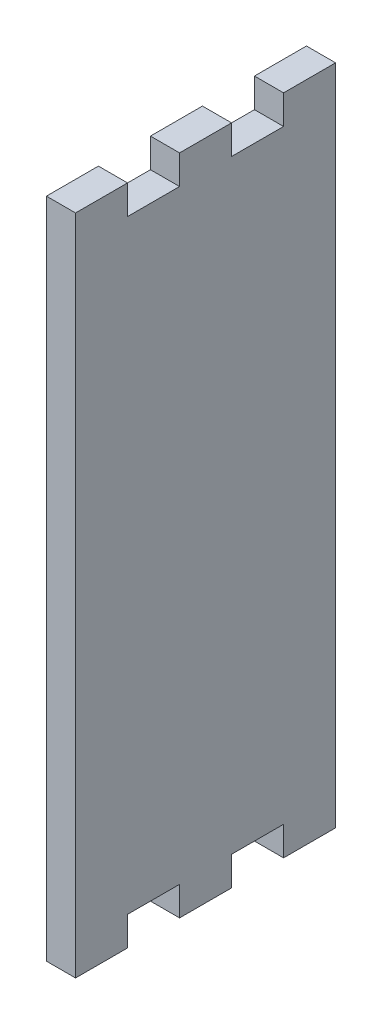
ISO-10303-21;
HEADER;
FILE_DESCRIPTION(('STEP AP214'),'2;1');
FILE_NAME('part.step','',(''),(''),'','','');
FILE_SCHEMA(('AUTOMOTIVE_DESIGN { 1 0 10303 214 1 1 1 1 }'));
ENDSEC;
DATA;
#1=APPLICATION_CONTEXT('core data for automotive mechanical design processes');
#2=APPLICATION_PROTOCOL_DEFINITION('international standard','automotive_design',2000,#1);
#3=PRODUCT_CONTEXT('',#1,'mechanical');
#4=PRODUCT('Part','Part','',(#3));
#5=PRODUCT_RELATED_PRODUCT_CATEGORY('part','',(#4));
#6=PRODUCT_DEFINITION_FORMATION('','',#4);
#7=PRODUCT_DEFINITION_CONTEXT('part definition',#1,'design');
#8=PRODUCT_DEFINITION('design','',#6,#7);
#9=PRODUCT_DEFINITION_SHAPE('','',#8);
#10=(LENGTH_UNIT() NAMED_UNIT(*) SI_UNIT(.MILLI.,.METRE.));
#11=(NAMED_UNIT(*) PLANE_ANGLE_UNIT() SI_UNIT($,.RADIAN.));
#12=(NAMED_UNIT(*) SI_UNIT($,.STERADIAN.) SOLID_ANGLE_UNIT());
#13=UNCERTAINTY_MEASURE_WITH_UNIT(LENGTH_MEASURE(1.E-05),#10,'distance_accuracy_value','');
#14=(GEOMETRIC_REPRESENTATION_CONTEXT(3) GLOBAL_UNCERTAINTY_ASSIGNED_CONTEXT((#13)) GLOBAL_UNIT_ASSIGNED_CONTEXT((#10,
#11,#12)) REPRESENTATION_CONTEXT('',''));
#15=CARTESIAN_POINT('',(0.,0.,0.));
#16=DIRECTION('',(0.,0.,1.));
#17=DIRECTION('',(1.,0.,0.));
#18=AXIS2_PLACEMENT_3D('',#15,#16,#17);
#19=CARTESIAN_POINT('',(129.305687175353,12.8931544247676,138.889594997105));
#20=DIRECTION('',(0.,0.,1.));
#21=DIRECTION('',(1.,0.,0.));
#22=AXIS2_PLACEMENT_3D('',#19,#20,#21);
#23=PLANE('',#22);
#24=DIRECTION('',(0.,-1.,0.));
#25=VECTOR('',#24,1.);
#26=CARTESIAN_POINT('',(134.905687175353,12.8931544247676,138.889594997105));
#27=LINE('',#26,#25);
#28=CARTESIAN_POINT('',(134.905687175353,134.693154424768,138.889594997105));
#29=VERTEX_POINT('',#28);
#30=CARTESIAN_POINT('',(134.905687175353,7.29315442476763,138.889594997105));
#31=VERTEX_POINT('',#30);
#32=EDGE_CURVE('E121',#29,#31,#27,.T.);
#33=ORIENTED_EDGE('',*,*,#32,.F.);
#34=DIRECTION('',(1.,0.,0.));
#35=VECTOR('',#34,1.);
#36=CARTESIAN_POINT('',(129.305687175353,134.693154424768,138.889594997105));
#37=LINE('',#36,#35);
#38=CARTESIAN_POINT('',(129.305687175353,134.693154424768,138.889594997105));
#39=VERTEX_POINT('',#38);
#40=EDGE_CURVE('E11',#39,#29,#37,.T.);
#41=ORIENTED_EDGE('',*,*,#40,.F.);
#42=DIRECTION('',(0.,-1.,0.));
#43=VECTOR('',#42,1.);
#44=CARTESIAN_POINT('',(129.305687175353,12.8931544247676,138.889594997105));
#45=LINE('',#44,#43);
#46=CARTESIAN_POINT('',(129.305687175353,7.29315442476763,138.889594997105));
#47=VERTEX_POINT('',#46);
#48=EDGE_CURVE('E51',#39,#47,#45,.T.);
#49=ORIENTED_EDGE('',*,*,#48,.T.);
#50=DIRECTION('',(1.,0.,0.));
#51=VECTOR('',#50,1.);
#52=CARTESIAN_POINT('',(129.305687175353,7.29315442476763,138.889594997105));
#53=LINE('',#52,#51);
#54=EDGE_CURVE('E36',#47,#31,#53,.T.);
#55=ORIENTED_EDGE('',*,*,#54,.T.);
#56=EDGE_LOOP('',(#33,#41,#49,#55));
#57=FACE_BOUND('',#56,.T.);
#58=ADVANCED_FACE('F32',(#57),#23,.T.);
#59=CARTESIAN_POINT('',(129.305687175353,134.693154424768,128.889594997104));
#60=DIRECTION('',(0.,1.,0.));
#61=DIRECTION('',(0.,0.,1.));
#62=AXIS2_PLACEMENT_3D('',#59,#60,#61);
#63=PLANE('',#62);
#64=DIRECTION('',(0.,0.,1.));
#65=VECTOR('',#64,1.);
#66=CARTESIAN_POINT('',(134.905687175353,134.693154424768,128.889594997104));
#67=LINE('',#66,#65);
#68=CARTESIAN_POINT('',(134.905687175353,134.693154424768,128.889594997104));
#69=VERTEX_POINT('',#68);
#70=EDGE_CURVE('E255',#69,#29,#67,.T.);
#71=ORIENTED_EDGE('',*,*,#70,.F.);
#72=DIRECTION('',(1.,0.,0.));
#73=VECTOR('',#72,1.);
#74=CARTESIAN_POINT('',(129.305687175353,134.693154424768,128.889594997104));
#75=LINE('',#74,#73);
#76=CARTESIAN_POINT('',(129.305687175353,134.693154424768,128.889594997104));
#77=VERTEX_POINT('',#76);
#78=EDGE_CURVE('E42',#77,#69,#75,.T.);
#79=ORIENTED_EDGE('',*,*,#78,.F.);
#80=DIRECTION('',(0.,0.,1.));
#81=VECTOR('',#80,1.);
#82=CARTESIAN_POINT('',(129.305687175353,134.693154424768,128.889594997104));
#83=LINE('',#82,#81);
#84=EDGE_CURVE('E194',#77,#39,#83,.T.);
#85=ORIENTED_EDGE('',*,*,#84,.T.);
#86=ORIENTED_EDGE('',*,*,#40,.T.);
#87=EDGE_LOOP('',(#71,#79,#85,#86));
#88=FACE_BOUND('',#87,.T.);
#89=ADVANCED_FACE('F294',(#88),#63,.T.);
#90=CARTESIAN_POINT('',(129.305687175353,129.093154424768,128.889594997104));
#91=DIRECTION('',(0.,0.,-1.));
#92=DIRECTION('',(-1.,0.,0.));
#93=AXIS2_PLACEMENT_3D('',#90,#91,#92);
#94=PLANE('',#93);
#95=DIRECTION('',(0.,1.,0.));
#96=VECTOR('',#95,1.);
#97=CARTESIAN_POINT('',(134.905687175353,129.093154424768,128.889594997104));
#98=LINE('',#97,#96);
#99=CARTESIAN_POINT('',(134.905687175353,129.093154424768,128.889594997104));
#100=VERTEX_POINT('',#99);
#101=EDGE_CURVE('E181',#100,#69,#98,.T.);
#102=ORIENTED_EDGE('',*,*,#101,.F.);
#103=DIRECTION('',(1.,0.,0.));
#104=VECTOR('',#103,1.);
#105=CARTESIAN_POINT('',(129.305687175353,129.093154424768,128.889594997104));
#106=LINE('',#105,#104);
#107=CARTESIAN_POINT('',(129.305687175353,129.093154424768,128.889594997104));
#108=VERTEX_POINT('',#107);
#109=EDGE_CURVE('E176',#108,#100,#106,.T.);
#110=ORIENTED_EDGE('',*,*,#109,.F.);
#111=DIRECTION('',(0.,1.,0.));
#112=VECTOR('',#111,1.);
#113=CARTESIAN_POINT('',(129.305687175353,129.093154424768,128.889594997104));
#114=LINE('',#113,#112);
#115=EDGE_CURVE('E179',#108,#77,#114,.T.);
#116=ORIENTED_EDGE('',*,*,#115,.T.);
#117=ORIENTED_EDGE('',*,*,#78,.T.);
#118=EDGE_LOOP('',(#102,#110,#116,#117));
#119=FACE_BOUND('',#118,.T.);
#120=ADVANCED_FACE('F178',(#119),#94,.T.);
#121=CARTESIAN_POINT('',(129.305687175353,129.093154424768,128.889594997104));
#122=DIRECTION('',(0.,1.,0.));
#123=DIRECTION('',(0.,0.,1.));
#124=AXIS2_PLACEMENT_3D('',#121,#122,#123);
#125=PLANE('',#124);
#126=DIRECTION('',(0.,0.,1.));
#127=VECTOR('',#126,1.);
#128=CARTESIAN_POINT('',(134.905687175353,129.093154424768,128.889594997104));
#129=LINE('',#128,#127);
#130=CARTESIAN_POINT('',(134.905687175353,129.093154424768,118.889594997105));
#131=VERTEX_POINT('',#130);
#132=EDGE_CURVE('E252',#131,#100,#129,.T.);
#133=ORIENTED_EDGE('',*,*,#132,.F.);
#134=DIRECTION('',(1.,0.,0.));
#135=VECTOR('',#134,1.);
#136=CARTESIAN_POINT('',(129.305687175353,129.093154424768,118.889594997105));
#137=LINE('',#136,#135);
#138=CARTESIAN_POINT('',(129.305687175353,129.093154424768,118.889594997105));
#139=VERTEX_POINT('',#138);
#140=EDGE_CURVE('E186',#139,#131,#137,.T.);
#141=ORIENTED_EDGE('',*,*,#140,.F.);
#142=DIRECTION('',(0.,0.,1.));
#143=VECTOR('',#142,1.);
#144=CARTESIAN_POINT('',(129.305687175353,129.093154424768,128.889594997104));
#145=LINE('',#144,#143);
#146=EDGE_CURVE('E191',#139,#108,#145,.T.);
#147=ORIENTED_EDGE('',*,*,#146,.T.);
#148=ORIENTED_EDGE('',*,*,#109,.T.);
#149=EDGE_LOOP('',(#133,#141,#147,#148));
#150=FACE_BOUND('',#149,.T.);
#151=ADVANCED_FACE('F196',(#150),#125,.T.);
#152=CARTESIAN_POINT('',(129.305687175353,134.693154424768,118.889594997105));
#153=DIRECTION('',(0.,0.,1.));
#154=DIRECTION('',(1.,0.,0.));
#155=AXIS2_PLACEMENT_3D('',#152,#153,#154);
#156=PLANE('',#155);
#157=DIRECTION('',(0.,-1.,0.));
#158=VECTOR('',#157,1.);
#159=CARTESIAN_POINT('',(134.905687175353,134.693154424768,118.889594997105));
#160=LINE('',#159,#158);
#161=CARTESIAN_POINT('',(134.905687175353,134.693154424768,118.889594997105));
#162=VERTEX_POINT('',#161);
#163=EDGE_CURVE('E249',#162,#131,#160,.T.);
#164=ORIENTED_EDGE('',*,*,#163,.F.);
#165=DIRECTION('',(1.,0.,0.));
#166=VECTOR('',#165,1.);
#167=CARTESIAN_POINT('',(129.305687175353,134.693154424768,118.889594997105));
#168=LINE('',#167,#166);
#169=CARTESIAN_POINT('',(129.305687175353,134.693154424768,118.889594997105));
#170=VERTEX_POINT('',#169);
#171=EDGE_CURVE('E261',#170,#162,#168,.T.);
#172=ORIENTED_EDGE('',*,*,#171,.F.);
#173=DIRECTION('',(0.,-1.,0.));
#174=VECTOR('',#173,1.);
#175=CARTESIAN_POINT('',(129.305687175353,134.693154424768,118.889594997105));
#176=LINE('',#175,#174);
#177=EDGE_CURVE('E197',#170,#139,#176,.T.);
#178=ORIENTED_EDGE('',*,*,#177,.T.);
#179=ORIENTED_EDGE('',*,*,#140,.T.);
#180=EDGE_LOOP('',(#164,#172,#178,#179));
#181=FACE_BOUND('',#180,.T.);
#182=ADVANCED_FACE('F307',(#181),#156,.T.);
#183=CARTESIAN_POINT('',(129.305687175353,134.693154424768,108.889594997104));
#184=DIRECTION('',(0.,1.,0.));
#185=DIRECTION('',(0.,0.,1.));
#186=AXIS2_PLACEMENT_3D('',#183,#184,#185);
#187=PLANE('',#186);
#188=DIRECTION('',(0.,0.,1.));
#189=VECTOR('',#188,1.);
#190=CARTESIAN_POINT('',(134.905687175353,134.693154424768,108.889594997104));
#191=LINE('',#190,#189);
#192=CARTESIAN_POINT('',(134.905687175353,134.693154424768,108.889594997104));
#193=VERTEX_POINT('',#192);
#194=EDGE_CURVE('E246',#193,#162,#191,.T.);
#195=ORIENTED_EDGE('',*,*,#194,.F.);
#196=DIRECTION('',(1.,0.,0.));
#197=VECTOR('',#196,1.);
#198=CARTESIAN_POINT('',(129.305687175353,134.693154424768,108.889594997104));
#199=LINE('',#198,#197);
#200=CARTESIAN_POINT('',(129.305687175353,134.693154424768,108.889594997104));
#201=VERTEX_POINT('',#200);
#202=EDGE_CURVE('E263',#201,#193,#199,.T.);
#203=ORIENTED_EDGE('',*,*,#202,.F.);
#204=DIRECTION('',(0.,0.,1.));
#205=VECTOR('',#204,1.);
#206=CARTESIAN_POINT('',(129.305687175353,134.693154424768,108.889594997104));
#207=LINE('',#206,#205);
#208=EDGE_CURVE('E199',#201,#170,#207,.T.);
#209=ORIENTED_EDGE('',*,*,#208,.T.);
#210=ORIENTED_EDGE('',*,*,#171,.T.);
#211=EDGE_LOOP('',(#195,#203,#209,#210));
#212=FACE_BOUND('',#211,.T.);
#213=ADVANCED_FACE('F310',(#212),#187,.T.);
#214=CARTESIAN_POINT('',(129.305687175353,129.093154424768,108.889594997104));
#215=DIRECTION('',(0.,0.,-1.));
#216=DIRECTION('',(-1.,0.,0.));
#217=AXIS2_PLACEMENT_3D('',#214,#215,#216);
#218=PLANE('',#217);
#219=DIRECTION('',(0.,1.,0.));
#220=VECTOR('',#219,1.);
#221=CARTESIAN_POINT('',(134.905687175353,129.093154424768,108.889594997104));
#222=LINE('',#221,#220);
#223=CARTESIAN_POINT('',(134.905687175353,129.093154424768,108.889594997104));
#224=VERTEX_POINT('',#223);
#225=EDGE_CURVE('E243',#224,#193,#222,.T.);
#226=ORIENTED_EDGE('',*,*,#225,.F.);
#227=DIRECTION('',(1.,0.,0.));
#228=VECTOR('',#227,1.);
#229=CARTESIAN_POINT('',(129.305687175353,129.093154424768,108.889594997104));
#230=LINE('',#229,#228);
#231=CARTESIAN_POINT('',(129.305687175353,129.093154424768,108.889594997104));
#232=VERTEX_POINT('',#231);
#233=EDGE_CURVE('E265',#232,#224,#230,.T.);
#234=ORIENTED_EDGE('',*,*,#233,.F.);
#235=DIRECTION('',(0.,1.,0.));
#236=VECTOR('',#235,1.);
#237=CARTESIAN_POINT('',(129.305687175353,129.093154424768,108.889594997104));
#238=LINE('',#237,#236);
#239=EDGE_CURVE('E414',#232,#201,#238,.T.);
#240=ORIENTED_EDGE('',*,*,#239,.T.);
#241=ORIENTED_EDGE('',*,*,#202,.T.);
#242=EDGE_LOOP('',(#226,#234,#240,#241));
#243=FACE_BOUND('',#242,.T.);
#244=ADVANCED_FACE('F314',(#243),#218,.T.);
#245=CARTESIAN_POINT('',(129.305687175353,129.093154424768,108.889594997104));
#246=DIRECTION('',(0.,1.,0.));
#247=DIRECTION('',(0.,0.,1.));
#248=AXIS2_PLACEMENT_3D('',#245,#246,#247);
#249=PLANE('',#248);
#250=DIRECTION('',(0.,0.,1.));
#251=VECTOR('',#250,1.);
#252=CARTESIAN_POINT('',(134.905687175353,129.093154424768,108.889594997104));
#253=LINE('',#252,#251);
#254=CARTESIAN_POINT('',(134.905687175353,129.093154424768,98.8895949971045));
#255=VERTEX_POINT('',#254);
#256=EDGE_CURVE('E240',#255,#224,#253,.T.);
#257=ORIENTED_EDGE('',*,*,#256,.F.);
#258=DIRECTION('',(1.,0.,0.));
#259=VECTOR('',#258,1.);
#260=CARTESIAN_POINT('',(129.305687175353,129.093154424768,98.8895949971045));
#261=LINE('',#260,#259);
#262=CARTESIAN_POINT('',(129.305687175353,129.093154424768,98.8895949971045));
#263=VERTEX_POINT('',#262);
#264=EDGE_CURVE('E267',#263,#255,#261,.T.);
#265=ORIENTED_EDGE('',*,*,#264,.F.);
#266=DIRECTION('',(0.,0.,1.));
#267=VECTOR('',#266,1.);
#268=CARTESIAN_POINT('',(129.305687175353,129.093154424768,108.889594997104));
#269=LINE('',#268,#267);
#270=EDGE_CURVE('E410',#263,#232,#269,.T.);
#271=ORIENTED_EDGE('',*,*,#270,.T.);
#272=ORIENTED_EDGE('',*,*,#233,.T.);
#273=EDGE_LOOP('',(#257,#265,#271,#272));
#274=FACE_BOUND('',#273,.T.);
#275=ADVANCED_FACE('F318',(#274),#249,.T.);
#276=CARTESIAN_POINT('',(129.305687175353,134.693154424768,98.8895949971045));
#277=DIRECTION('',(0.,0.,1.));
#278=DIRECTION('',(1.,0.,0.));
#279=AXIS2_PLACEMENT_3D('',#276,#277,#278);
#280=PLANE('',#279);
#281=DIRECTION('',(0.,-1.,0.));
#282=VECTOR('',#281,1.);
#283=CARTESIAN_POINT('',(134.905687175353,134.693154424768,98.8895949971045));
#284=LINE('',#283,#282);
#285=CARTESIAN_POINT('',(134.905687175353,134.693154424768,98.8895949971045));
#286=VERTEX_POINT('',#285);
#287=EDGE_CURVE('E237',#286,#255,#284,.T.);
#288=ORIENTED_EDGE('',*,*,#287,.F.);
#289=DIRECTION('',(1.,0.,0.));
#290=VECTOR('',#289,1.);
#291=CARTESIAN_POINT('',(129.305687175353,134.693154424768,98.8895949971045));
#292=LINE('',#291,#290);
#293=CARTESIAN_POINT('',(129.305687175353,134.693154424768,98.8895949971045));
#294=VERTEX_POINT('',#293);
#295=EDGE_CURVE('E269',#294,#286,#292,.T.);
#296=ORIENTED_EDGE('',*,*,#295,.F.);
#297=DIRECTION('',(0.,-1.,0.));
#298=VECTOR('',#297,1.);
#299=CARTESIAN_POINT('',(129.305687175353,134.693154424768,98.8895949971045));
#300=LINE('',#299,#298);
#301=EDGE_CURVE('E421',#294,#263,#300,.T.);
#302=ORIENTED_EDGE('',*,*,#301,.T.);
#303=ORIENTED_EDGE('',*,*,#264,.T.);
#304=EDGE_LOOP('',(#288,#296,#302,#303));
#305=FACE_BOUND('',#304,.T.);
#306=ADVANCED_FACE('F322',(#305),#280,.T.);
#307=CARTESIAN_POINT('',(129.305687175353,134.693154424768,88.8895949971045));
#308=DIRECTION('',(0.,1.,0.));
#309=DIRECTION('',(0.,0.,1.));
#310=AXIS2_PLACEMENT_3D('',#307,#308,#309);
#311=PLANE('',#310);
#312=DIRECTION('',(0.,0.,1.));
#313=VECTOR('',#312,1.);
#314=CARTESIAN_POINT('',(134.905687175353,134.693154424768,88.8895949971045));
#315=LINE('',#314,#313);
#316=CARTESIAN_POINT('',(134.905687175353,134.693154424768,88.8895949971045));
#317=VERTEX_POINT('',#316);
#318=EDGE_CURVE('E234',#317,#286,#315,.T.);
#319=ORIENTED_EDGE('',*,*,#318,.F.);
#320=DIRECTION('',(1.,0.,0.));
#321=VECTOR('',#320,1.);
#322=CARTESIAN_POINT('',(129.305687175353,134.693154424768,88.8895949971045));
#323=LINE('',#322,#321);
#324=CARTESIAN_POINT('',(129.305687175353,134.693154424768,88.8895949971045));
#325=VERTEX_POINT('',#324);
#326=EDGE_CURVE('E271',#325,#317,#323,.T.);
#327=ORIENTED_EDGE('',*,*,#326,.F.);
#328=DIRECTION('',(0.,0.,1.));
#329=VECTOR('',#328,1.);
#330=CARTESIAN_POINT('',(129.305687175353,134.693154424768,88.8895949971045));
#331=LINE('',#330,#329);
#332=EDGE_CURVE('E403',#325,#294,#331,.T.);
#333=ORIENTED_EDGE('',*,*,#332,.T.);
#334=ORIENTED_EDGE('',*,*,#295,.T.);
#335=EDGE_LOOP('',(#319,#327,#333,#334));
#336=FACE_BOUND('',#335,.T.);
#337=ADVANCED_FACE('F326',(#336),#311,.T.);
#338=CARTESIAN_POINT('',(129.305687175353,129.093154424768,88.8895949971045));
#339=DIRECTION('',(0.,0.,-1.));
#340=DIRECTION('',(-1.,0.,0.));
#341=AXIS2_PLACEMENT_3D('',#338,#339,#340);
#342=PLANE('',#341);
#343=DIRECTION('',(0.,1.,0.));
#344=VECTOR('',#343,1.);
#345=CARTESIAN_POINT('',(134.905687175353,129.093154424768,88.8895949971045));
#346=LINE('',#345,#344);
#347=CARTESIAN_POINT('',(134.905687175353,7.29315442476763,88.8895949971045));
#348=VERTEX_POINT('',#347);
#349=EDGE_CURVE('E231',#348,#317,#346,.T.);
#350=ORIENTED_EDGE('',*,*,#349,.F.);
#351=DIRECTION('',(1.,0.,0.));
#352=VECTOR('',#351,1.);
#353=CARTESIAN_POINT('',(129.305687175353,7.29315442476763,88.8895949971045));
#354=LINE('',#353,#352);
#355=CARTESIAN_POINT('',(129.305687175353,7.29315442476763,88.8895949971045));
#356=VERTEX_POINT('',#355);
#357=EDGE_CURVE('E273',#356,#348,#354,.T.);
#358=ORIENTED_EDGE('',*,*,#357,.F.);
#359=DIRECTION('',(0.,1.,0.));
#360=VECTOR('',#359,1.);
#361=CARTESIAN_POINT('',(129.305687175353,7.29315442476763,88.8895949971045));
#362=LINE('',#361,#360);
#363=EDGE_CURVE('E399',#356,#325,#362,.T.);
#364=ORIENTED_EDGE('',*,*,#363,.T.);
#365=ORIENTED_EDGE('',*,*,#326,.T.);
#366=EDGE_LOOP('',(#350,#358,#364,#365));
#367=FACE_BOUND('',#366,.T.);
#368=ADVANCED_FACE('F330',(#367),#342,.T.);
#369=CARTESIAN_POINT('',(129.305687175353,7.29315442476763,98.8895949971045));
#370=DIRECTION('',(0.,-1.,0.));
#371=DIRECTION('',(0.,0.,-1.));
#372=AXIS2_PLACEMENT_3D('',#369,#370,#371);
#373=PLANE('',#372);
#374=DIRECTION('',(0.,0.,-1.));
#375=VECTOR('',#374,1.);
#376=CARTESIAN_POINT('',(134.905687175353,7.29315442476763,98.8895949971045));
#377=LINE('',#376,#375);
#378=CARTESIAN_POINT('',(134.905687175353,7.29315442476763,98.8895949971045));
#379=VERTEX_POINT('',#378);
#380=EDGE_CURVE('E228',#379,#348,#377,.T.);
#381=ORIENTED_EDGE('',*,*,#380,.F.);
#382=DIRECTION('',(1.,0.,0.));
#383=VECTOR('',#382,1.);
#384=CARTESIAN_POINT('',(129.305687175353,7.29315442476763,98.8895949971045));
#385=LINE('',#384,#383);
#386=CARTESIAN_POINT('',(129.305687175353,7.29315442476763,98.8895949971045));
#387=VERTEX_POINT('',#386);
#388=EDGE_CURVE('E276',#387,#379,#385,.T.);
#389=ORIENTED_EDGE('',*,*,#388,.F.);
#390=DIRECTION('',(0.,0.,-1.));
#391=VECTOR('',#390,1.);
#392=CARTESIAN_POINT('',(129.305687175353,7.29315442476763,98.8895949971045));
#393=LINE('',#392,#391);
#394=EDGE_CURVE('E425',#387,#356,#393,.T.);
#395=ORIENTED_EDGE('',*,*,#394,.T.);
#396=ORIENTED_EDGE('',*,*,#357,.T.);
#397=EDGE_LOOP('',(#381,#389,#395,#396));
#398=FACE_BOUND('',#397,.T.);
#399=ADVANCED_FACE('F334',(#398),#373,.T.);
#400=CARTESIAN_POINT('',(129.305687175353,12.8931544247676,98.8895949971045));
#401=DIRECTION('',(0.,0.,1.));
#402=DIRECTION('',(1.,0.,0.));
#403=AXIS2_PLACEMENT_3D('',#400,#401,#402);
#404=PLANE('',#403);
#405=DIRECTION('',(0.,-1.,0.));
#406=VECTOR('',#405,1.);
#407=CARTESIAN_POINT('',(134.905687175353,12.8931544247676,98.8895949971045));
#408=LINE('',#407,#406);
#409=CARTESIAN_POINT('',(134.905687175353,12.8931544247676,98.8895949971045));
#410=VERTEX_POINT('',#409);
#411=EDGE_CURVE('E225',#410,#379,#408,.T.);
#412=ORIENTED_EDGE('',*,*,#411,.F.);
#413=DIRECTION('',(1.,0.,0.));
#414=VECTOR('',#413,1.);
#415=CARTESIAN_POINT('',(129.305687175353,12.8931544247676,98.8895949971045));
#416=LINE('',#415,#414);
#417=CARTESIAN_POINT('',(129.305687175353,12.8931544247676,98.8895949971045));
#418=VERTEX_POINT('',#417);
#419=EDGE_CURVE('E278',#418,#410,#416,.T.);
#420=ORIENTED_EDGE('',*,*,#419,.F.);
#421=DIRECTION('',(0.,-1.,0.));
#422=VECTOR('',#421,1.);
#423=CARTESIAN_POINT('',(129.305687175353,12.8931544247676,98.8895949971045));
#424=LINE('',#423,#422);
#425=EDGE_CURVE('E393',#418,#387,#424,.T.);
#426=ORIENTED_EDGE('',*,*,#425,.T.);
#427=ORIENTED_EDGE('',*,*,#388,.T.);
#428=EDGE_LOOP('',(#412,#420,#426,#427));
#429=FACE_BOUND('',#428,.T.);
#430=ADVANCED_FACE('F338',(#429),#404,.T.);
#431=CARTESIAN_POINT('',(129.305687175353,12.8931544247676,108.889594997104));
#432=DIRECTION('',(0.,-1.,0.));
#433=DIRECTION('',(0.,0.,-1.));
#434=AXIS2_PLACEMENT_3D('',#431,#432,#433);
#435=PLANE('',#434);
#436=DIRECTION('',(0.,0.,-1.));
#437=VECTOR('',#436,1.);
#438=CARTESIAN_POINT('',(134.905687175353,12.8931544247676,108.889594997104));
#439=LINE('',#438,#437);
#440=CARTESIAN_POINT('',(134.905687175353,12.8931544247676,108.889594997104));
#441=VERTEX_POINT('',#440);
#442=EDGE_CURVE('E222',#441,#410,#439,.T.);
#443=ORIENTED_EDGE('',*,*,#442,.F.);
#444=DIRECTION('',(1.,0.,0.));
#445=VECTOR('',#444,1.);
#446=CARTESIAN_POINT('',(129.305687175353,12.8931544247676,108.889594997104));
#447=LINE('',#446,#445);
#448=CARTESIAN_POINT('',(129.305687175353,12.8931544247676,108.889594997104));
#449=VERTEX_POINT('',#448);
#450=EDGE_CURVE('E280',#449,#441,#447,.T.);
#451=ORIENTED_EDGE('',*,*,#450,.F.);
#452=DIRECTION('',(0.,0.,-1.));
#453=VECTOR('',#452,1.);
#454=CARTESIAN_POINT('',(129.305687175353,12.8931544247676,108.889594997104));
#455=LINE('',#454,#453);
#456=EDGE_CURVE('E389',#449,#418,#455,.T.);
#457=ORIENTED_EDGE('',*,*,#456,.T.);
#458=ORIENTED_EDGE('',*,*,#419,.T.);
#459=EDGE_LOOP('',(#443,#451,#457,#458));
#460=FACE_BOUND('',#459,.T.);
#461=ADVANCED_FACE('F342',(#460),#435,.T.);
#462=CARTESIAN_POINT('',(129.305687175353,7.29315442476763,108.889594997104));
#463=DIRECTION('',(0.,0.,-1.));
#464=DIRECTION('',(-1.,0.,0.));
#465=AXIS2_PLACEMENT_3D('',#462,#463,#464);
#466=PLANE('',#465);
#467=DIRECTION('',(0.,1.,0.));
#468=VECTOR('',#467,1.);
#469=CARTESIAN_POINT('',(134.905687175353,7.29315442476763,108.889594997104));
#470=LINE('',#469,#468);
#471=CARTESIAN_POINT('',(134.905687175353,7.29315442476763,108.889594997104));
#472=VERTEX_POINT('',#471);
#473=EDGE_CURVE('E219',#472,#441,#470,.T.);
#474=ORIENTED_EDGE('',*,*,#473,.F.);
#475=DIRECTION('',(1.,0.,0.));
#476=VECTOR('',#475,1.);
#477=CARTESIAN_POINT('',(129.305687175353,7.29315442476763,108.889594997104));
#478=LINE('',#477,#476);
#479=CARTESIAN_POINT('',(129.305687175353,7.29315442476763,108.889594997104));
#480=VERTEX_POINT('',#479);
#481=EDGE_CURVE('E282',#480,#472,#478,.T.);
#482=ORIENTED_EDGE('',*,*,#481,.F.);
#483=DIRECTION('',(0.,1.,0.));
#484=VECTOR('',#483,1.);
#485=CARTESIAN_POINT('',(129.305687175353,7.29315442476763,108.889594997104));
#486=LINE('',#485,#484);
#487=EDGE_CURVE('E429',#480,#449,#486,.T.);
#488=ORIENTED_EDGE('',*,*,#487,.T.);
#489=ORIENTED_EDGE('',*,*,#450,.T.);
#490=EDGE_LOOP('',(#474,#482,#488,#489));
#491=FACE_BOUND('',#490,.T.);
#492=ADVANCED_FACE('F346',(#491),#466,.T.);
#493=CARTESIAN_POINT('',(129.305687175353,7.29315442476763,118.889594997105));
#494=DIRECTION('',(0.,-1.,0.));
#495=DIRECTION('',(0.,0.,-1.));
#496=AXIS2_PLACEMENT_3D('',#493,#494,#495);
#497=PLANE('',#496);
#498=DIRECTION('',(0.,0.,-1.));
#499=VECTOR('',#498,1.);
#500=CARTESIAN_POINT('',(134.905687175353,7.29315442476763,118.889594997105));
#501=LINE('',#500,#499);
#502=CARTESIAN_POINT('',(134.905687175353,7.29315442476763,118.889594997105));
#503=VERTEX_POINT('',#502);
#504=EDGE_CURVE('E216',#503,#472,#501,.T.);
#505=ORIENTED_EDGE('',*,*,#504,.F.);
#506=DIRECTION('',(1.,0.,0.));
#507=VECTOR('',#506,1.);
#508=CARTESIAN_POINT('',(129.305687175353,7.29315442476763,118.889594997105));
#509=LINE('',#508,#507);
#510=CARTESIAN_POINT('',(129.305687175353,7.29315442476763,118.889594997105));
#511=VERTEX_POINT('',#510);
#512=EDGE_CURVE('E284',#511,#503,#509,.T.);
#513=ORIENTED_EDGE('',*,*,#512,.F.);
#514=DIRECTION('',(0.,0.,-1.));
#515=VECTOR('',#514,1.);
#516=CARTESIAN_POINT('',(129.305687175353,7.29315442476763,118.889594997105));
#517=LINE('',#516,#515);
#518=EDGE_CURVE('E382',#511,#480,#517,.T.);
#519=ORIENTED_EDGE('',*,*,#518,.T.);
#520=ORIENTED_EDGE('',*,*,#481,.T.);
#521=EDGE_LOOP('',(#505,#513,#519,#520));
#522=FACE_BOUND('',#521,.T.);
#523=ADVANCED_FACE('F350',(#522),#497,.T.);
#524=CARTESIAN_POINT('',(129.305687175353,12.8931544247676,118.889594997105));
#525=DIRECTION('',(0.,0.,1.));
#526=DIRECTION('',(1.,0.,0.));
#527=AXIS2_PLACEMENT_3D('',#524,#525,#526);
#528=PLANE('',#527);
#529=DIRECTION('',(0.,-1.,0.));
#530=VECTOR('',#529,1.);
#531=CARTESIAN_POINT('',(134.905687175353,12.8931544247676,118.889594997105));
#532=LINE('',#531,#530);
#533=CARTESIAN_POINT('',(134.905687175353,12.8931544247676,118.889594997105));
#534=VERTEX_POINT('',#533);
#535=EDGE_CURVE('E213',#534,#503,#532,.T.);
#536=ORIENTED_EDGE('',*,*,#535,.F.);
#537=DIRECTION('',(1.,0.,0.));
#538=VECTOR('',#537,1.);
#539=CARTESIAN_POINT('',(129.305687175353,12.8931544247676,118.889594997105));
#540=LINE('',#539,#538);
#541=CARTESIAN_POINT('',(129.305687175353,12.8931544247676,118.889594997105));
#542=VERTEX_POINT('',#541);
#543=EDGE_CURVE('E286',#542,#534,#540,.T.);
#544=ORIENTED_EDGE('',*,*,#543,.F.);
#545=DIRECTION('',(0.,-1.,0.));
#546=VECTOR('',#545,1.);
#547=CARTESIAN_POINT('',(129.305687175353,12.8931544247676,118.889594997105));
#548=LINE('',#547,#546);
#549=EDGE_CURVE('E378',#542,#511,#548,.T.);
#550=ORIENTED_EDGE('',*,*,#549,.T.);
#551=ORIENTED_EDGE('',*,*,#512,.T.);
#552=EDGE_LOOP('',(#536,#544,#550,#551));
#553=FACE_BOUND('',#552,.T.);
#554=ADVANCED_FACE('F354',(#553),#528,.T.);
#555=CARTESIAN_POINT('',(129.305687175353,12.8931544247676,128.889594997104));
#556=DIRECTION('',(0.,-1.,0.));
#557=DIRECTION('',(0.,0.,-1.));
#558=AXIS2_PLACEMENT_3D('',#555,#556,#557);
#559=PLANE('',#558);
#560=DIRECTION('',(0.,0.,-1.));
#561=VECTOR('',#560,1.);
#562=CARTESIAN_POINT('',(134.905687175353,12.8931544247676,128.889594997104));
#563=LINE('',#562,#561);
#564=CARTESIAN_POINT('',(134.905687175353,12.8931544247676,128.889594997104));
#565=VERTEX_POINT('',#564);
#566=EDGE_CURVE('E210',#565,#534,#563,.T.);
#567=ORIENTED_EDGE('',*,*,#566,.F.);
#568=DIRECTION('',(1.,0.,0.));
#569=VECTOR('',#568,1.);
#570=CARTESIAN_POINT('',(129.305687175353,12.8931544247676,128.889594997104));
#571=LINE('',#570,#569);
#572=CARTESIAN_POINT('',(129.305687175353,12.8931544247676,128.889594997104));
#573=VERTEX_POINT('',#572);
#574=EDGE_CURVE('E288',#573,#565,#571,.T.);
#575=ORIENTED_EDGE('',*,*,#574,.F.);
#576=DIRECTION('',(0.,0.,-1.));
#577=VECTOR('',#576,1.);
#578=CARTESIAN_POINT('',(129.305687175353,12.8931544247676,128.889594997104));
#579=LINE('',#578,#577);
#580=EDGE_CURVE('E433',#573,#542,#579,.T.);
#581=ORIENTED_EDGE('',*,*,#580,.T.);
#582=ORIENTED_EDGE('',*,*,#543,.T.);
#583=EDGE_LOOP('',(#567,#575,#581,#582));
#584=FACE_BOUND('',#583,.T.);
#585=ADVANCED_FACE('F358',(#584),#559,.T.);
#586=CARTESIAN_POINT('',(129.305687175353,7.29315442476763,128.889594997104));
#587=DIRECTION('',(0.,0.,-1.));
#588=DIRECTION('',(-1.,0.,0.));
#589=AXIS2_PLACEMENT_3D('',#586,#587,#588);
#590=PLANE('',#589);
#591=DIRECTION('',(0.,1.,0.));
#592=VECTOR('',#591,1.);
#593=CARTESIAN_POINT('',(134.905687175353,7.29315442476763,128.889594997104));
#594=LINE('',#593,#592);
#595=CARTESIAN_POINT('',(134.905687175353,7.29315442476763,128.889594997104));
#596=VERTEX_POINT('',#595);
#597=EDGE_CURVE('E207',#596,#565,#594,.T.);
#598=ORIENTED_EDGE('',*,*,#597,.F.);
#599=DIRECTION('',(1.,0.,0.));
#600=VECTOR('',#599,1.);
#601=CARTESIAN_POINT('',(129.305687175353,7.29315442476763,128.889594997104));
#602=LINE('',#601,#600);
#603=CARTESIAN_POINT('',(129.305687175353,7.29315442476763,128.889594997104));
#604=VERTEX_POINT('',#603);
#605=EDGE_CURVE('E289',#604,#596,#602,.T.);
#606=ORIENTED_EDGE('',*,*,#605,.F.);
#607=DIRECTION('',(0.,1.,0.));
#608=VECTOR('',#607,1.);
#609=CARTESIAN_POINT('',(129.305687175353,7.29315442476763,128.889594997104));
#610=LINE('',#609,#608);
#611=EDGE_CURVE('E371',#604,#573,#610,.T.);
#612=ORIENTED_EDGE('',*,*,#611,.T.);
#613=ORIENTED_EDGE('',*,*,#574,.T.);
#614=EDGE_LOOP('',(#598,#606,#612,#613));
#615=FACE_BOUND('',#614,.T.);
#616=ADVANCED_FACE('F361',(#615),#590,.T.);
#617=CARTESIAN_POINT('',(129.305687175353,7.29315442476763,138.889594997105));
#618=DIRECTION('',(0.,-1.,0.));
#619=DIRECTION('',(0.,0.,-1.));
#620=AXIS2_PLACEMENT_3D('',#617,#618,#619);
#621=PLANE('',#620);
#622=DIRECTION('',(0.,0.,-1.));
#623=VECTOR('',#622,1.);
#624=CARTESIAN_POINT('',(134.905687175353,7.29315442476763,138.889594997105));
#625=LINE('',#624,#623);
#626=EDGE_CURVE('E204',#31,#596,#625,.T.);
#627=ORIENTED_EDGE('',*,*,#626,.F.);
#628=ORIENTED_EDGE('',*,*,#54,.F.);
#629=DIRECTION('',(0.,0.,-1.));
#630=VECTOR('',#629,1.);
#631=CARTESIAN_POINT('',(129.305687175353,7.29315442476763,138.889594997105));
#632=LINE('',#631,#630);
#633=EDGE_CURVE('E436',#47,#604,#632,.T.);
#634=ORIENTED_EDGE('',*,*,#633,.T.);
#635=ORIENTED_EDGE('',*,*,#605,.T.);
#636=EDGE_LOOP('',(#627,#628,#634,#635));
#637=FACE_BOUND('',#636,.T.);
#638=ADVANCED_FACE('F34',(#637),#621,.T.);
#639=CARTESIAN_POINT('',(129.305687175353,0.,0.));
#640=DIRECTION('',(1.,0.,0.));
#641=DIRECTION('',(0.,0.,-1.));
#642=AXIS2_PLACEMENT_3D('',#639,#640,#641);
#643=PLANE('',#642);
#644=ORIENTED_EDGE('',*,*,#48,.F.);
#645=ORIENTED_EDGE('',*,*,#84,.F.);
#646=ORIENTED_EDGE('',*,*,#115,.F.);
#647=ORIENTED_EDGE('',*,*,#146,.F.);
#648=ORIENTED_EDGE('',*,*,#177,.F.);
#649=ORIENTED_EDGE('',*,*,#208,.F.);
#650=ORIENTED_EDGE('',*,*,#239,.F.);
#651=ORIENTED_EDGE('',*,*,#270,.F.);
#652=ORIENTED_EDGE('',*,*,#301,.F.);
#653=ORIENTED_EDGE('',*,*,#332,.F.);
#654=ORIENTED_EDGE('',*,*,#363,.F.);
#655=ORIENTED_EDGE('',*,*,#394,.F.);
#656=ORIENTED_EDGE('',*,*,#425,.F.);
#657=ORIENTED_EDGE('',*,*,#456,.F.);
#658=ORIENTED_EDGE('',*,*,#487,.F.);
#659=ORIENTED_EDGE('',*,*,#518,.F.);
#660=ORIENTED_EDGE('',*,*,#549,.F.);
#661=ORIENTED_EDGE('',*,*,#580,.F.);
#662=ORIENTED_EDGE('',*,*,#611,.F.);
#663=ORIENTED_EDGE('',*,*,#633,.F.);
#664=EDGE_LOOP('',(#644,#645,#646,#647,#648,#649,#650,#651,#652,#653,#654,#655,#656,#657,#658,
#659,#660,#661,#662,#663));
#665=FACE_BOUND('',#664,.T.);
#666=ADVANCED_FACE('F189',(#665),#643,.F.);
#667=CARTESIAN_POINT('',(134.905687175353,0.,0.));
#668=DIRECTION('',(1.,0.,0.));
#669=DIRECTION('',(0.,0.,-1.));
#670=AXIS2_PLACEMENT_3D('',#667,#668,#669);
#671=PLANE('',#670);
#672=ORIENTED_EDGE('',*,*,#32,.T.);
#673=ORIENTED_EDGE('',*,*,#626,.T.);
#674=ORIENTED_EDGE('',*,*,#597,.T.);
#675=ORIENTED_EDGE('',*,*,#566,.T.);
#676=ORIENTED_EDGE('',*,*,#535,.T.);
#677=ORIENTED_EDGE('',*,*,#504,.T.);
#678=ORIENTED_EDGE('',*,*,#473,.T.);
#679=ORIENTED_EDGE('',*,*,#442,.T.);
#680=ORIENTED_EDGE('',*,*,#411,.T.);
#681=ORIENTED_EDGE('',*,*,#380,.T.);
#682=ORIENTED_EDGE('',*,*,#349,.T.);
#683=ORIENTED_EDGE('',*,*,#318,.T.);
#684=ORIENTED_EDGE('',*,*,#287,.T.);
#685=ORIENTED_EDGE('',*,*,#256,.T.);
#686=ORIENTED_EDGE('',*,*,#225,.T.);
#687=ORIENTED_EDGE('',*,*,#194,.T.);
#688=ORIENTED_EDGE('',*,*,#163,.T.);
#689=ORIENTED_EDGE('',*,*,#132,.T.);
#690=ORIENTED_EDGE('',*,*,#101,.T.);
#691=ORIENTED_EDGE('',*,*,#70,.T.);
#692=EDGE_LOOP('',(#672,#673,#674,#675,#676,#677,#678,#679,#680,#681,#682,#683,#684,#685,#686,
#687,#688,#689,#690,#691));
#693=FACE_BOUND('',#692,.T.);
#694=ADVANCED_FACE('F292',(#693),#671,.T.);
#695=CLOSED_SHELL('',(#58,#89,#120,#151,#182,#213,#244,#275,#306,#337,#368,#399,#430,#461,#492,
#523,#554,#585,#616,#638,#666,#694));
#696=MANIFOLD_SOLID_BREP('B2',#695);
#697=ADVANCED_BREP_SHAPE_REPRESENTATION('',(#18,#696),#14);
#698=SHAPE_DEFINITION_REPRESENTATION(#9,#697);
ENDSEC;
END-ISO-10303-21;
